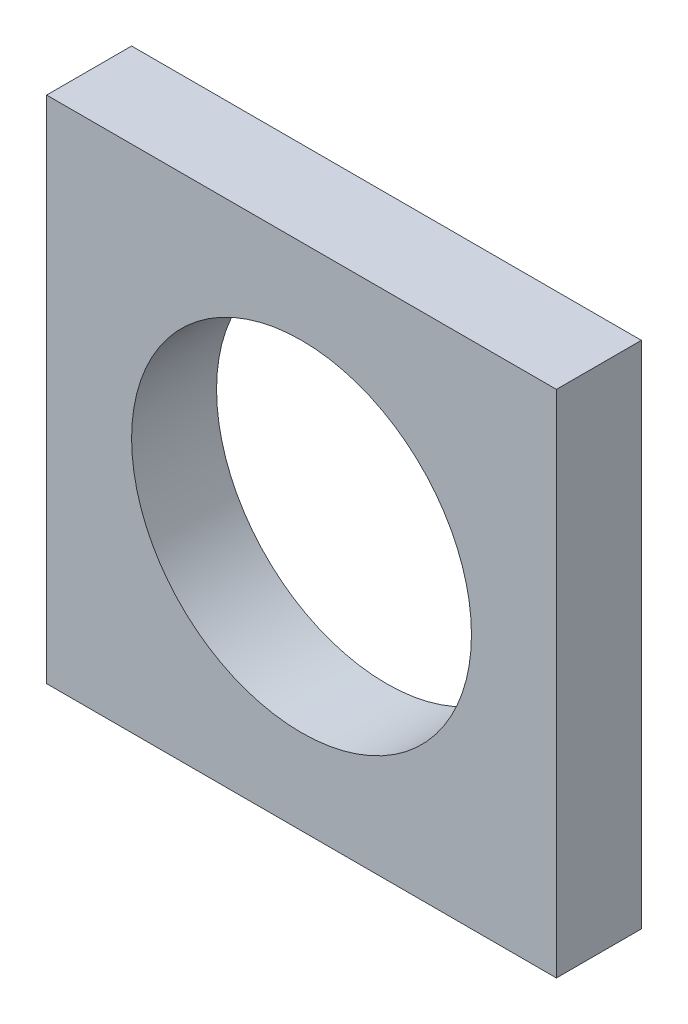
ISO-10303-21;
HEADER;
FILE_DESCRIPTION(('STEP AP214'),'2;1');
FILE_NAME('part.step','',(''),(''),'','','');
FILE_SCHEMA(('AUTOMOTIVE_DESIGN { 1 0 10303 214 1 1 1 1 }'));
ENDSEC;
DATA;
#1=APPLICATION_CONTEXT('core data for automotive mechanical design processes');
#2=APPLICATION_PROTOCOL_DEFINITION('international standard','automotive_design',2000,#1);
#3=PRODUCT_CONTEXT('',#1,'mechanical');
#4=PRODUCT('Part','Part','',(#3));
#5=PRODUCT_RELATED_PRODUCT_CATEGORY('part','',(#4));
#6=PRODUCT_DEFINITION_FORMATION('','',#4);
#7=PRODUCT_DEFINITION_CONTEXT('part definition',#1,'design');
#8=PRODUCT_DEFINITION('design','',#6,#7);
#9=PRODUCT_DEFINITION_SHAPE('','',#8);
#10=(LENGTH_UNIT() NAMED_UNIT(*) SI_UNIT(.MILLI.,.METRE.));
#11=(NAMED_UNIT(*) PLANE_ANGLE_UNIT() SI_UNIT($,.RADIAN.));
#12=(NAMED_UNIT(*) SI_UNIT($,.STERADIAN.) SOLID_ANGLE_UNIT());
#13=UNCERTAINTY_MEASURE_WITH_UNIT(LENGTH_MEASURE(1.E-05),#10,'distance_accuracy_value','');
#14=(GEOMETRIC_REPRESENTATION_CONTEXT(3) GLOBAL_UNCERTAINTY_ASSIGNED_CONTEXT((#13)) GLOBAL_UNIT_ASSIGNED_CONTEXT((#10,
#11,#12)) REPRESENTATION_CONTEXT('',''));
#15=CARTESIAN_POINT('',(0.,0.,0.));
#16=DIRECTION('',(0.,0.,1.));
#17=DIRECTION('',(1.,0.,0.));
#18=AXIS2_PLACEMENT_3D('',#15,#16,#17);
#19=CARTESIAN_POINT('',(0.,0.,0.5));
#20=DIRECTION('',(0.,0.,-1.));
#21=DIRECTION('',(-1.,0.,0.));
#22=AXIS2_PLACEMENT_3D('',#19,#20,#21);
#23=PLANE('',#22);
#24=DIRECTION('',(0.,-1.,0.));
#25=VECTOR('',#24,1.);
#26=CARTESIAN_POINT('',(0.,0.,0.5));
#27=LINE('',#26,#25);
#28=CARTESIAN_POINT('',(0.,6.,0.5));
#29=VERTEX_POINT('',#28);
#30=CARTESIAN_POINT('',(0.,0.,0.5));
#31=VERTEX_POINT('',#30);
#32=EDGE_CURVE('E92',#29,#31,#27,.T.);
#33=ORIENTED_EDGE('',*,*,#32,.T.);
#34=DIRECTION('',(1.,0.,0.));
#35=VECTOR('',#34,1.);
#36=CARTESIAN_POINT('',(0.,0.,0.5));
#37=LINE('',#36,#35);
#38=CARTESIAN_POINT('',(6.,0.,0.5));
#39=VERTEX_POINT('',#38);
#40=EDGE_CURVE('E87',#31,#39,#37,.T.);
#41=ORIENTED_EDGE('',*,*,#40,.T.);
#42=DIRECTION('',(0.,1.,0.));
#43=VECTOR('',#42,1.);
#44=CARTESIAN_POINT('',(6.,0.,0.5));
#45=LINE('',#44,#43);
#46=CARTESIAN_POINT('',(6.,6.,0.5));
#47=VERTEX_POINT('',#46);
#48=EDGE_CURVE('E90',#39,#47,#45,.T.);
#49=ORIENTED_EDGE('',*,*,#48,.T.);
#50=DIRECTION('',(-1.,0.,0.));
#51=VECTOR('',#50,1.);
#52=CARTESIAN_POINT('',(0.,6.,0.5));
#53=LINE('',#52,#51);
#54=EDGE_CURVE('E57',#47,#29,#53,.T.);
#55=ORIENTED_EDGE('',*,*,#54,.T.);
#56=EDGE_LOOP('',(#33,#41,#49,#55));
#57=FACE_BOUND('',#56,.T.);
#58=CARTESIAN_POINT('',(3.,3.,0.5));
#59=DIRECTION('',(0.,0.,1.));
#60=DIRECTION('',(1.,0.,0.));
#61=AXIS2_PLACEMENT_3D('',#58,#59,#60);
#62=CIRCLE('',#61,2.);
#63=CARTESIAN_POINT('',(5.,3.,0.5));
#64=VERTEX_POINT('',#63);
#65=EDGE_CURVE('E112',#64,#64,#62,.T.);
#66=ORIENTED_EDGE('',*,*,#65,.F.);
#67=EDGE_LOOP('',(#66));
#68=FACE_BOUND('',#67,.T.);
#69=ADVANCED_FACE('F39',(#57,#68),#23,.F.);
#70=CARTESIAN_POINT('',(0.,0.,-0.5));
#71=DIRECTION('',(0.,0.,-1.));
#72=DIRECTION('',(-1.,0.,0.));
#73=AXIS2_PLACEMENT_3D('',#70,#71,#72);
#74=PLANE('',#73);
#75=DIRECTION('',(0.,-1.,0.));
#76=VECTOR('',#75,1.);
#77=CARTESIAN_POINT('',(0.,0.,-0.5));
#78=LINE('',#77,#76);
#79=CARTESIAN_POINT('',(0.,6.,-0.5));
#80=VERTEX_POINT('',#79);
#81=CARTESIAN_POINT('',(0.,0.,-0.5));
#82=VERTEX_POINT('',#81);
#83=EDGE_CURVE('E108',#80,#82,#78,.T.);
#84=ORIENTED_EDGE('',*,*,#83,.F.);
#85=DIRECTION('',(-1.,0.,0.));
#86=VECTOR('',#85,1.);
#87=CARTESIAN_POINT('',(0.,6.,-0.5));
#88=LINE('',#87,#86);
#89=CARTESIAN_POINT('',(6.,6.,-0.5));
#90=VERTEX_POINT('',#89);
#91=EDGE_CURVE('E80',#90,#80,#88,.T.);
#92=ORIENTED_EDGE('',*,*,#91,.F.);
#93=DIRECTION('',(0.,1.,0.));
#94=VECTOR('',#93,1.);
#95=CARTESIAN_POINT('',(6.,0.,-0.5));
#96=LINE('',#95,#94);
#97=CARTESIAN_POINT('',(6.,0.,-0.5));
#98=VERTEX_POINT('',#97);
#99=EDGE_CURVE('E74',#98,#90,#96,.T.);
#100=ORIENTED_EDGE('',*,*,#99,.F.);
#101=DIRECTION('',(1.,0.,0.));
#102=VECTOR('',#101,1.);
#103=CARTESIAN_POINT('',(0.,0.,-0.5));
#104=LINE('',#103,#102);
#105=EDGE_CURVE('E97',#82,#98,#104,.T.);
#106=ORIENTED_EDGE('',*,*,#105,.F.);
#107=EDGE_LOOP('',(#84,#92,#100,#106));
#108=FACE_BOUND('',#107,.T.);
#109=CARTESIAN_POINT('',(3.,3.,-0.5));
#110=DIRECTION('',(0.,0.,1.));
#111=DIRECTION('',(1.,0.,0.));
#112=AXIS2_PLACEMENT_3D('',#109,#110,#111);
#113=CIRCLE('',#112,2.);
#114=CARTESIAN_POINT('',(5.,3.,-0.5));
#115=VERTEX_POINT('',#114);
#116=EDGE_CURVE('E130',#115,#115,#113,.T.);
#117=ORIENTED_EDGE('',*,*,#116,.T.);
#118=EDGE_LOOP('',(#117));
#119=FACE_BOUND('',#118,.T.);
#120=ADVANCED_FACE('F125',(#108,#119),#74,.T.);
#121=CARTESIAN_POINT('',(0.,0.,0.5));
#122=DIRECTION('',(1.,0.,0.));
#123=DIRECTION('',(0.,0.,-1.));
#124=AXIS2_PLACEMENT_3D('',#121,#122,#123);
#125=PLANE('',#124);
#126=ORIENTED_EDGE('',*,*,#83,.T.);
#127=DIRECTION('',(0.,0.,-1.));
#128=VECTOR('',#127,1.);
#129=CARTESIAN_POINT('',(0.,0.,0.5));
#130=LINE('',#129,#128);
#131=EDGE_CURVE('E11',#31,#82,#130,.T.);
#132=ORIENTED_EDGE('',*,*,#131,.F.);
#133=ORIENTED_EDGE('',*,*,#32,.F.);
#134=DIRECTION('',(0.,0.,-1.));
#135=VECTOR('',#134,1.);
#136=CARTESIAN_POINT('',(0.,6.,0.5));
#137=LINE('',#136,#135);
#138=EDGE_CURVE('E104',#29,#80,#137,.T.);
#139=ORIENTED_EDGE('',*,*,#138,.T.);
#140=EDGE_LOOP('',(#126,#132,#133,#139));
#141=FACE_BOUND('',#140,.T.);
#142=ADVANCED_FACE('F41',(#141),#125,.F.);
#143=CARTESIAN_POINT('',(0.,0.,0.5));
#144=DIRECTION('',(0.,1.,0.));
#145=DIRECTION('',(0.,0.,1.));
#146=AXIS2_PLACEMENT_3D('',#143,#144,#145);
#147=PLANE('',#146);
#148=ORIENTED_EDGE('',*,*,#105,.T.);
#149=DIRECTION('',(0.,0.,-1.));
#150=VECTOR('',#149,1.);
#151=CARTESIAN_POINT('',(6.,0.,0.5));
#152=LINE('',#151,#150);
#153=EDGE_CURVE('E49',#39,#98,#152,.T.);
#154=ORIENTED_EDGE('',*,*,#153,.F.);
#155=ORIENTED_EDGE('',*,*,#40,.F.);
#156=ORIENTED_EDGE('',*,*,#131,.T.);
#157=EDGE_LOOP('',(#148,#154,#155,#156));
#158=FACE_BOUND('',#157,.T.);
#159=ADVANCED_FACE('F96',(#158),#147,.F.);
#160=CARTESIAN_POINT('',(6.,0.,0.5));
#161=DIRECTION('',(-1.,0.,0.));
#162=DIRECTION('',(0.,0.,1.));
#163=AXIS2_PLACEMENT_3D('',#160,#161,#162);
#164=PLANE('',#163);
#165=ORIENTED_EDGE('',*,*,#99,.T.);
#166=DIRECTION('',(0.,0.,-1.));
#167=VECTOR('',#166,1.);
#168=CARTESIAN_POINT('',(6.,6.,0.5));
#169=LINE('',#168,#167);
#170=EDGE_CURVE('E99',#47,#90,#169,.T.);
#171=ORIENTED_EDGE('',*,*,#170,.F.);
#172=ORIENTED_EDGE('',*,*,#48,.F.);
#173=ORIENTED_EDGE('',*,*,#153,.T.);
#174=EDGE_LOOP('',(#165,#171,#172,#173));
#175=FACE_BOUND('',#174,.T.);
#176=ADVANCED_FACE('F100',(#175),#164,.F.);
#177=CARTESIAN_POINT('',(0.,6.,0.5));
#178=DIRECTION('',(0.,-1.,0.));
#179=DIRECTION('',(0.,0.,-1.));
#180=AXIS2_PLACEMENT_3D('',#177,#178,#179);
#181=PLANE('',#180);
#182=ORIENTED_EDGE('',*,*,#91,.T.);
#183=ORIENTED_EDGE('',*,*,#138,.F.);
#184=ORIENTED_EDGE('',*,*,#54,.F.);
#185=ORIENTED_EDGE('',*,*,#170,.T.);
#186=EDGE_LOOP('',(#182,#183,#184,#185));
#187=FACE_BOUND('',#186,.T.);
#188=ADVANCED_FACE('F122',(#187),#181,.F.);
#189=CARTESIAN_POINT('',(3.,3.,0.5));
#190=DIRECTION('',(0.,0.,-1.));
#191=DIRECTION('',(-1.,0.,0.));
#192=AXIS2_PLACEMENT_3D('',#189,#190,#191);
#193=CYLINDRICAL_SURFACE('',#192,2.);
#194=ORIENTED_EDGE('',*,*,#65,.T.);
#195=EDGE_LOOP('',(#194));
#196=FACE_BOUND('',#195,.T.);
#197=ORIENTED_EDGE('',*,*,#116,.F.);
#198=EDGE_LOOP('',(#197));
#199=FACE_BOUND('',#198,.T.);
#200=ADVANCED_FACE('F138',(#196,#199),#193,.F.);
#201=CLOSED_SHELL('',(#69,#120,#142,#159,#176,#188,#200));
#202=MANIFOLD_SOLID_BREP('B2',#201);
#203=ADVANCED_BREP_SHAPE_REPRESENTATION('',(#18,#202),#14);
#204=SHAPE_DEFINITION_REPRESENTATION(#9,#203);
ENDSEC;
END-ISO-10303-21;
